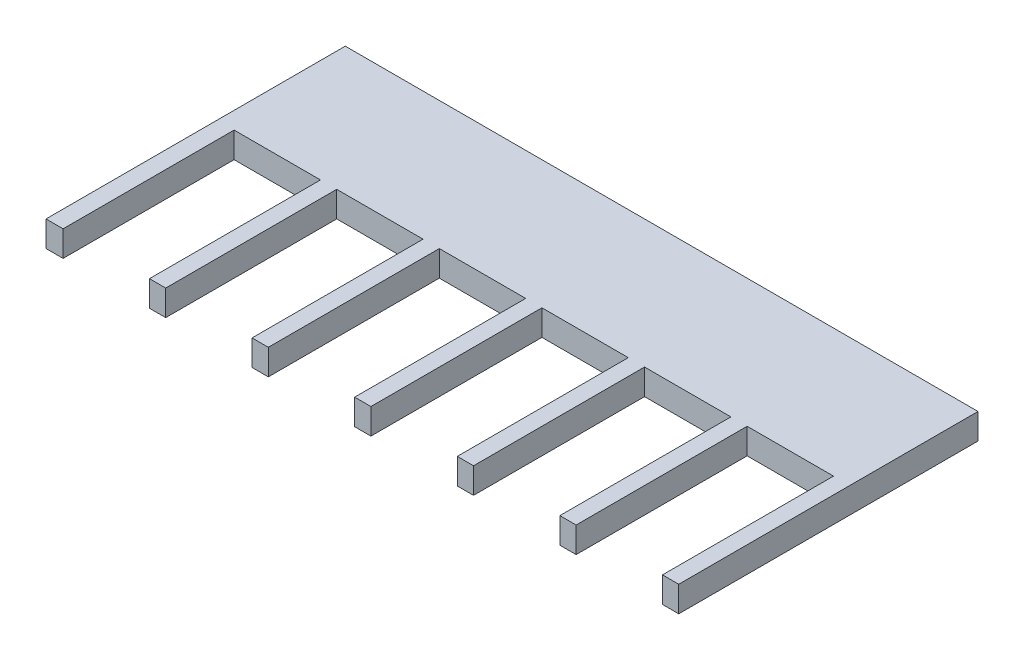
ISO-10303-21;
HEADER;
FILE_DESCRIPTION(('STEP AP214'),'2;1');
FILE_NAME('part.step','',(''),(''),'','','');
FILE_SCHEMA(('AUTOMOTIVE_DESIGN { 1 0 10303 214 1 1 1 1 }'));
ENDSEC;
DATA;
#1=APPLICATION_CONTEXT('core data for automotive mechanical design processes');
#2=APPLICATION_PROTOCOL_DEFINITION('international standard','automotive_design',2000,#1);
#3=PRODUCT_CONTEXT('',#1,'mechanical');
#4=PRODUCT('Part','Part','',(#3));
#5=PRODUCT_RELATED_PRODUCT_CATEGORY('part','',(#4));
#6=PRODUCT_DEFINITION_FORMATION('','',#4);
#7=PRODUCT_DEFINITION_CONTEXT('part definition',#1,'design');
#8=PRODUCT_DEFINITION('design','',#6,#7);
#9=PRODUCT_DEFINITION_SHAPE('','',#8);
#10=(LENGTH_UNIT() NAMED_UNIT(*) SI_UNIT(.MILLI.,.METRE.));
#11=(NAMED_UNIT(*) PLANE_ANGLE_UNIT() SI_UNIT($,.RADIAN.));
#12=(NAMED_UNIT(*) SI_UNIT($,.STERADIAN.) SOLID_ANGLE_UNIT());
#13=UNCERTAINTY_MEASURE_WITH_UNIT(LENGTH_MEASURE(1.E-05),#10,'distance_accuracy_value','');
#14=(GEOMETRIC_REPRESENTATION_CONTEXT(3) GLOBAL_UNCERTAINTY_ASSIGNED_CONTEXT((#13)) GLOBAL_UNIT_ASSIGNED_CONTEXT((#10,
#11,#12)) REPRESENTATION_CONTEXT('',''));
#15=CARTESIAN_POINT('',(0.,0.,0.));
#16=DIRECTION('',(0.,0.,1.));
#17=DIRECTION('',(1.,0.,0.));
#18=AXIS2_PLACEMENT_3D('',#15,#16,#17);
#19=CARTESIAN_POINT('',(0.,3.,0.));
#20=DIRECTION('',(0.,0.,1.));
#21=DIRECTION('',(1.,0.,0.));
#22=AXIS2_PLACEMENT_3D('',#19,#20,#21);
#23=PLANE('',#22);
#24=DIRECTION('',(-1.,0.,0.));
#25=VECTOR('',#24,1.);
#26=CARTESIAN_POINT('',(0.,0.,0.));
#27=LINE('',#26,#25);
#28=CARTESIAN_POINT('',(73.9999999999999,0.,0.));
#29=VERTEX_POINT('',#28);
#30=CARTESIAN_POINT('',(0.,0.,0.));
#31=VERTEX_POINT('',#30);
#32=EDGE_CURVE('E249',#29,#31,#27,.T.);
#33=ORIENTED_EDGE('',*,*,#32,.T.);
#34=DIRECTION('',(0.,-1.,0.));
#35=VECTOR('',#34,1.);
#36=CARTESIAN_POINT('',(0.,3.,0.));
#37=LINE('',#36,#35);
#38=CARTESIAN_POINT('',(0.,3.,0.));
#39=VERTEX_POINT('',#38);
#40=EDGE_CURVE('E11',#39,#31,#37,.T.);
#41=ORIENTED_EDGE('',*,*,#40,.F.);
#42=DIRECTION('',(-1.,0.,0.));
#43=VECTOR('',#42,1.);
#44=CARTESIAN_POINT('',(0.,3.,0.));
#45=LINE('',#44,#43);
#46=CARTESIAN_POINT('',(73.9999999999999,3.,0.));
#47=VERTEX_POINT('',#46);
#48=EDGE_CURVE('E309',#47,#39,#45,.T.);
#49=ORIENTED_EDGE('',*,*,#48,.F.);
#50=DIRECTION('',(0.,-1.,0.));
#51=VECTOR('',#50,1.);
#52=CARTESIAN_POINT('',(73.9999999999999,3.,0.));
#53=LINE('',#52,#51);
#54=EDGE_CURVE('E245',#47,#29,#53,.T.);
#55=ORIENTED_EDGE('',*,*,#54,.T.);
#56=EDGE_LOOP('',(#33,#41,#49,#55));
#57=FACE_BOUND('',#56,.T.);
#58=ADVANCED_FACE('F33',(#57),#23,.F.);
#59=CARTESIAN_POINT('',(0.,3.,35.));
#60=DIRECTION('',(1.,0.,0.));
#61=DIRECTION('',(0.,0.,-1.));
#62=AXIS2_PLACEMENT_3D('',#59,#60,#61);
#63=PLANE('',#62);
#64=DIRECTION('',(0.,0.,1.));
#65=VECTOR('',#64,1.);
#66=CARTESIAN_POINT('',(0.,0.,35.));
#67=LINE('',#66,#65);
#68=CARTESIAN_POINT('',(0.,0.,35.));
#69=VERTEX_POINT('',#68);
#70=EDGE_CURVE('E252',#31,#69,#67,.T.);
#71=ORIENTED_EDGE('',*,*,#70,.T.);
#72=DIRECTION('',(0.,-1.,0.));
#73=VECTOR('',#72,1.);
#74=CARTESIAN_POINT('',(0.,3.,35.));
#75=LINE('',#74,#73);
#76=CARTESIAN_POINT('',(0.,3.,35.));
#77=VERTEX_POINT('',#76);
#78=EDGE_CURVE('E41',#77,#69,#75,.T.);
#79=ORIENTED_EDGE('',*,*,#78,.F.);
#80=DIRECTION('',(0.,0.,1.));
#81=VECTOR('',#80,1.);
#82=CARTESIAN_POINT('',(0.,3.,35.));
#83=LINE('',#82,#81);
#84=EDGE_CURVE('E152',#39,#77,#83,.T.);
#85=ORIENTED_EDGE('',*,*,#84,.F.);
#86=ORIENTED_EDGE('',*,*,#40,.T.);
#87=EDGE_LOOP('',(#71,#79,#85,#86));
#88=FACE_BOUND('',#87,.T.);
#89=ADVANCED_FACE('F465',(#88),#63,.F.);
#90=CARTESIAN_POINT('',(0.,3.,35.));
#91=DIRECTION('',(0.,0.,-1.));
#92=DIRECTION('',(-1.,0.,0.));
#93=AXIS2_PLACEMENT_3D('',#90,#91,#92);
#94=PLANE('',#93);
#95=DIRECTION('',(1.,0.,0.));
#96=VECTOR('',#95,1.);
#97=CARTESIAN_POINT('',(0.,0.,35.));
#98=LINE('',#97,#96);
#99=CARTESIAN_POINT('',(2.00000000000001,0.,35.));
#100=VERTEX_POINT('',#99);
#101=EDGE_CURVE('E254',#69,#100,#98,.T.);
#102=ORIENTED_EDGE('',*,*,#101,.T.);
#103=DIRECTION('',(0.,-1.,0.));
#104=VECTOR('',#103,1.);
#105=CARTESIAN_POINT('',(2.00000000000001,3.,35.));
#106=LINE('',#105,#104);
#107=CARTESIAN_POINT('',(2.00000000000001,3.,35.));
#108=VERTEX_POINT('',#107);
#109=EDGE_CURVE('E376',#108,#100,#106,.T.);
#110=ORIENTED_EDGE('',*,*,#109,.F.);
#111=DIRECTION('',(1.,0.,0.));
#112=VECTOR('',#111,1.);
#113=CARTESIAN_POINT('',(0.,3.,35.));
#114=LINE('',#113,#112);
#115=EDGE_CURVE('E384',#77,#108,#114,.T.);
#116=ORIENTED_EDGE('',*,*,#115,.F.);
#117=ORIENTED_EDGE('',*,*,#78,.T.);
#118=EDGE_LOOP('',(#102,#110,#116,#117));
#119=FACE_BOUND('',#118,.T.);
#120=ADVANCED_FACE('F382',(#119),#94,.F.);
#121=CARTESIAN_POINT('',(2.00000000000001,3.,35.));
#122=DIRECTION('',(-1.,0.,0.));
#123=DIRECTION('',(0.,0.,1.));
#124=AXIS2_PLACEMENT_3D('',#121,#122,#123);
#125=PLANE('',#124);
#126=DIRECTION('',(0.,0.,-1.));
#127=VECTOR('',#126,1.);
#128=CARTESIAN_POINT('',(2.00000000000001,0.,35.));
#129=LINE('',#128,#127);
#130=CARTESIAN_POINT('',(2.,0.,15.));
#131=VERTEX_POINT('',#130);
#132=EDGE_CURVE('E256',#100,#131,#129,.T.);
#133=ORIENTED_EDGE('',*,*,#132,.T.);
#134=DIRECTION('',(0.,-1.,0.));
#135=VECTOR('',#134,1.);
#136=CARTESIAN_POINT('',(2.,3.,15.));
#137=LINE('',#136,#135);
#138=CARTESIAN_POINT('',(2.,3.,15.));
#139=VERTEX_POINT('',#138);
#140=EDGE_CURVE('E373',#139,#131,#137,.T.);
#141=ORIENTED_EDGE('',*,*,#140,.F.);
#142=DIRECTION('',(0.,0.,-1.));
#143=VECTOR('',#142,1.);
#144=CARTESIAN_POINT('',(2.00000000000001,3.,35.));
#145=LINE('',#144,#143);
#146=EDGE_CURVE('E401',#108,#139,#145,.T.);
#147=ORIENTED_EDGE('',*,*,#146,.F.);
#148=ORIENTED_EDGE('',*,*,#109,.T.);
#149=EDGE_LOOP('',(#133,#141,#147,#148));
#150=FACE_BOUND('',#149,.T.);
#151=ADVANCED_FACE('F392',(#150),#125,.F.);
#152=CARTESIAN_POINT('',(12.1,3.,15.));
#153=DIRECTION('',(0.,0.,-1.));
#154=DIRECTION('',(-1.,0.,0.));
#155=AXIS2_PLACEMENT_3D('',#152,#153,#154);
#156=PLANE('',#155);
#157=DIRECTION('',(1.,0.,0.));
#158=VECTOR('',#157,1.);
#159=CARTESIAN_POINT('',(12.1,0.,15.));
#160=LINE('',#159,#158);
#161=CARTESIAN_POINT('',(12.1,0.,15.));
#162=VERTEX_POINT('',#161);
#163=EDGE_CURVE('E259',#131,#162,#160,.T.);
#164=ORIENTED_EDGE('',*,*,#163,.T.);
#165=DIRECTION('',(0.,-1.,0.));
#166=VECTOR('',#165,1.);
#167=CARTESIAN_POINT('',(12.1,3.,15.));
#168=LINE('',#167,#166);
#169=CARTESIAN_POINT('',(12.1,3.,15.));
#170=VERTEX_POINT('',#169);
#171=EDGE_CURVE('E370',#170,#162,#168,.T.);
#172=ORIENTED_EDGE('',*,*,#171,.F.);
#173=DIRECTION('',(1.,0.,0.));
#174=VECTOR('',#173,1.);
#175=CARTESIAN_POINT('',(2.,3.,15.));
#176=LINE('',#175,#174);
#177=EDGE_CURVE('E398',#139,#170,#176,.T.);
#178=ORIENTED_EDGE('',*,*,#177,.F.);
#179=ORIENTED_EDGE('',*,*,#140,.T.);
#180=EDGE_LOOP('',(#164,#172,#178,#179));
#181=FACE_BOUND('',#180,.T.);
#182=ADVANCED_FACE('F396',(#181),#156,.F.);
#183=CARTESIAN_POINT('',(12.1,3.,15.));
#184=DIRECTION('',(1.,0.,0.));
#185=DIRECTION('',(0.,0.,-1.));
#186=AXIS2_PLACEMENT_3D('',#183,#184,#185);
#187=PLANE('',#186);
#188=DIRECTION('',(0.,0.,1.));
#189=VECTOR('',#188,1.);
#190=CARTESIAN_POINT('',(12.1,0.,15.));
#191=LINE('',#190,#189);
#192=CARTESIAN_POINT('',(12.1,0.,35.));
#193=VERTEX_POINT('',#192);
#194=EDGE_CURVE('E261',#162,#193,#191,.T.);
#195=ORIENTED_EDGE('',*,*,#194,.T.);
#196=DIRECTION('',(0.,-1.,0.));
#197=VECTOR('',#196,1.);
#198=CARTESIAN_POINT('',(12.1,3.,35.));
#199=LINE('',#198,#197);
#200=CARTESIAN_POINT('',(12.1,3.,35.));
#201=VERTEX_POINT('',#200);
#202=EDGE_CURVE('E367',#201,#193,#199,.T.);
#203=ORIENTED_EDGE('',*,*,#202,.F.);
#204=DIRECTION('',(0.,0.,1.));
#205=VECTOR('',#204,1.);
#206=CARTESIAN_POINT('',(12.1,3.,15.));
#207=LINE('',#206,#205);
#208=EDGE_CURVE('E400',#170,#201,#207,.T.);
#209=ORIENTED_EDGE('',*,*,#208,.F.);
#210=ORIENTED_EDGE('',*,*,#171,.T.);
#211=EDGE_LOOP('',(#195,#203,#209,#210));
#212=FACE_BOUND('',#211,.T.);
#213=ADVANCED_FACE('F478',(#212),#187,.F.);
#214=CARTESIAN_POINT('',(12.1,3.,35.));
#215=DIRECTION('',(0.,0.,-1.));
#216=DIRECTION('',(-1.,0.,0.));
#217=AXIS2_PLACEMENT_3D('',#214,#215,#216);
#218=PLANE('',#217);
#219=DIRECTION('',(1.,0.,0.));
#220=VECTOR('',#219,1.);
#221=CARTESIAN_POINT('',(12.1,0.,35.));
#222=LINE('',#221,#220);
#223=CARTESIAN_POINT('',(14.,0.,35.));
#224=VERTEX_POINT('',#223);
#225=EDGE_CURVE('E263',#193,#224,#222,.T.);
#226=ORIENTED_EDGE('',*,*,#225,.T.);
#227=DIRECTION('',(0.,-1.,0.));
#228=VECTOR('',#227,1.);
#229=CARTESIAN_POINT('',(14.,3.,35.));
#230=LINE('',#229,#228);
#231=CARTESIAN_POINT('',(14.,3.,35.));
#232=VERTEX_POINT('',#231);
#233=EDGE_CURVE('E364',#232,#224,#230,.T.);
#234=ORIENTED_EDGE('',*,*,#233,.F.);
#235=DIRECTION('',(1.,0.,0.));
#236=VECTOR('',#235,1.);
#237=CARTESIAN_POINT('',(12.1,3.,35.));
#238=LINE('',#237,#236);
#239=EDGE_CURVE('E403',#201,#232,#238,.T.);
#240=ORIENTED_EDGE('',*,*,#239,.F.);
#241=ORIENTED_EDGE('',*,*,#202,.T.);
#242=EDGE_LOOP('',(#226,#234,#240,#241));
#243=FACE_BOUND('',#242,.T.);
#244=ADVANCED_FACE('F481',(#243),#218,.F.);
#245=CARTESIAN_POINT('',(14.,3.,35.));
#246=DIRECTION('',(-1.,0.,0.));
#247=DIRECTION('',(0.,0.,1.));
#248=AXIS2_PLACEMENT_3D('',#245,#246,#247);
#249=PLANE('',#248);
#250=DIRECTION('',(0.,0.,-1.));
#251=VECTOR('',#250,1.);
#252=CARTESIAN_POINT('',(14.,0.,35.));
#253=LINE('',#252,#251);
#254=CARTESIAN_POINT('',(14.,0.,15.));
#255=VERTEX_POINT('',#254);
#256=EDGE_CURVE('E265',#224,#255,#253,.T.);
#257=ORIENTED_EDGE('',*,*,#256,.T.);
#258=DIRECTION('',(0.,-1.,0.));
#259=VECTOR('',#258,1.);
#260=CARTESIAN_POINT('',(14.,3.,15.));
#261=LINE('',#260,#259);
#262=CARTESIAN_POINT('',(14.,3.,15.));
#263=VERTEX_POINT('',#262);
#264=EDGE_CURVE('E361',#263,#255,#261,.T.);
#265=ORIENTED_EDGE('',*,*,#264,.F.);
#266=DIRECTION('',(0.,0.,-1.));
#267=VECTOR('',#266,1.);
#268=CARTESIAN_POINT('',(14.,3.,35.));
#269=LINE('',#268,#267);
#270=EDGE_CURVE('E409',#232,#263,#269,.T.);
#271=ORIENTED_EDGE('',*,*,#270,.F.);
#272=ORIENTED_EDGE('',*,*,#233,.T.);
#273=EDGE_LOOP('',(#257,#265,#271,#272));
#274=FACE_BOUND('',#273,.T.);
#275=ADVANCED_FACE('F485',(#274),#249,.F.);
#276=CARTESIAN_POINT('',(24.1,3.,15.));
#277=DIRECTION('',(0.,0.,-1.));
#278=DIRECTION('',(-1.,0.,0.));
#279=AXIS2_PLACEMENT_3D('',#276,#277,#278);
#280=PLANE('',#279);
#281=DIRECTION('',(1.,0.,0.));
#282=VECTOR('',#281,1.);
#283=CARTESIAN_POINT('',(24.1,0.,15.));
#284=LINE('',#283,#282);
#285=CARTESIAN_POINT('',(24.1,0.,15.));
#286=VERTEX_POINT('',#285);
#287=EDGE_CURVE('E268',#255,#286,#284,.T.);
#288=ORIENTED_EDGE('',*,*,#287,.T.);
#289=DIRECTION('',(0.,-1.,0.));
#290=VECTOR('',#289,1.);
#291=CARTESIAN_POINT('',(24.1,3.,15.));
#292=LINE('',#291,#290);
#293=CARTESIAN_POINT('',(24.1,3.,15.));
#294=VERTEX_POINT('',#293);
#295=EDGE_CURVE('E358',#294,#286,#292,.T.);
#296=ORIENTED_EDGE('',*,*,#295,.F.);
#297=DIRECTION('',(1.,0.,0.));
#298=VECTOR('',#297,1.);
#299=CARTESIAN_POINT('',(14.,3.,15.));
#300=LINE('',#299,#298);
#301=EDGE_CURVE('E411',#263,#294,#300,.T.);
#302=ORIENTED_EDGE('',*,*,#301,.F.);
#303=ORIENTED_EDGE('',*,*,#264,.T.);
#304=EDGE_LOOP('',(#288,#296,#302,#303));
#305=FACE_BOUND('',#304,.T.);
#306=ADVANCED_FACE('F489',(#305),#280,.F.);
#307=CARTESIAN_POINT('',(24.1,3.,15.));
#308=DIRECTION('',(1.,0.,0.));
#309=DIRECTION('',(0.,0.,-1.));
#310=AXIS2_PLACEMENT_3D('',#307,#308,#309);
#311=PLANE('',#310);
#312=DIRECTION('',(0.,0.,1.));
#313=VECTOR('',#312,1.);
#314=CARTESIAN_POINT('',(24.1,0.,15.));
#315=LINE('',#314,#313);
#316=CARTESIAN_POINT('',(24.1,0.,35.));
#317=VERTEX_POINT('',#316);
#318=EDGE_CURVE('E270',#286,#317,#315,.T.);
#319=ORIENTED_EDGE('',*,*,#318,.T.);
#320=DIRECTION('',(0.,-1.,0.));
#321=VECTOR('',#320,1.);
#322=CARTESIAN_POINT('',(24.1,3.,35.));
#323=LINE('',#322,#321);
#324=CARTESIAN_POINT('',(24.1,3.,35.));
#325=VERTEX_POINT('',#324);
#326=EDGE_CURVE('E355',#325,#317,#323,.T.);
#327=ORIENTED_EDGE('',*,*,#326,.F.);
#328=DIRECTION('',(0.,0.,1.));
#329=VECTOR('',#328,1.);
#330=CARTESIAN_POINT('',(24.1,3.,15.));
#331=LINE('',#330,#329);
#332=EDGE_CURVE('E413',#294,#325,#331,.T.);
#333=ORIENTED_EDGE('',*,*,#332,.F.);
#334=ORIENTED_EDGE('',*,*,#295,.T.);
#335=EDGE_LOOP('',(#319,#327,#333,#334));
#336=FACE_BOUND('',#335,.T.);
#337=ADVANCED_FACE('F493',(#336),#311,.F.);
#338=CARTESIAN_POINT('',(24.1,3.,35.));
#339=DIRECTION('',(0.,0.,-1.));
#340=DIRECTION('',(-1.,0.,0.));
#341=AXIS2_PLACEMENT_3D('',#338,#339,#340);
#342=PLANE('',#341);
#343=DIRECTION('',(1.,0.,0.));
#344=VECTOR('',#343,1.);
#345=CARTESIAN_POINT('',(24.1,0.,35.));
#346=LINE('',#345,#344);
#347=CARTESIAN_POINT('',(26.,0.,35.));
#348=VERTEX_POINT('',#347);
#349=EDGE_CURVE('E272',#317,#348,#346,.T.);
#350=ORIENTED_EDGE('',*,*,#349,.T.);
#351=DIRECTION('',(0.,-1.,0.));
#352=VECTOR('',#351,1.);
#353=CARTESIAN_POINT('',(26.,3.,35.));
#354=LINE('',#353,#352);
#355=CARTESIAN_POINT('',(26.,3.,35.));
#356=VERTEX_POINT('',#355);
#357=EDGE_CURVE('E352',#356,#348,#354,.T.);
#358=ORIENTED_EDGE('',*,*,#357,.F.);
#359=DIRECTION('',(1.,0.,0.));
#360=VECTOR('',#359,1.);
#361=CARTESIAN_POINT('',(24.1,3.,35.));
#362=LINE('',#361,#360);
#363=EDGE_CURVE('E415',#325,#356,#362,.T.);
#364=ORIENTED_EDGE('',*,*,#363,.F.);
#365=ORIENTED_EDGE('',*,*,#326,.T.);
#366=EDGE_LOOP('',(#350,#358,#364,#365));
#367=FACE_BOUND('',#366,.T.);
#368=ADVANCED_FACE('F497',(#367),#342,.F.);
#369=CARTESIAN_POINT('',(26.,3.,35.));
#370=DIRECTION('',(-1.,0.,0.));
#371=DIRECTION('',(0.,0.,1.));
#372=AXIS2_PLACEMENT_3D('',#369,#370,#371);
#373=PLANE('',#372);
#374=DIRECTION('',(0.,0.,-1.));
#375=VECTOR('',#374,1.);
#376=CARTESIAN_POINT('',(26.,0.,35.));
#377=LINE('',#376,#375);
#378=CARTESIAN_POINT('',(26.,0.,15.));
#379=VERTEX_POINT('',#378);
#380=EDGE_CURVE('E274',#348,#379,#377,.T.);
#381=ORIENTED_EDGE('',*,*,#380,.T.);
#382=DIRECTION('',(0.,-1.,0.));
#383=VECTOR('',#382,1.);
#384=CARTESIAN_POINT('',(26.,3.,15.));
#385=LINE('',#384,#383);
#386=CARTESIAN_POINT('',(26.,3.,15.));
#387=VERTEX_POINT('',#386);
#388=EDGE_CURVE('E349',#387,#379,#385,.T.);
#389=ORIENTED_EDGE('',*,*,#388,.F.);
#390=DIRECTION('',(0.,0.,-1.));
#391=VECTOR('',#390,1.);
#392=CARTESIAN_POINT('',(26.,3.,35.));
#393=LINE('',#392,#391);
#394=EDGE_CURVE('E417',#356,#387,#393,.T.);
#395=ORIENTED_EDGE('',*,*,#394,.F.);
#396=ORIENTED_EDGE('',*,*,#357,.T.);
#397=EDGE_LOOP('',(#381,#389,#395,#396));
#398=FACE_BOUND('',#397,.T.);
#399=ADVANCED_FACE('F501',(#398),#373,.F.);
#400=CARTESIAN_POINT('',(36.1,3.,15.));
#401=DIRECTION('',(0.,0.,-1.));
#402=DIRECTION('',(-1.,0.,0.));
#403=AXIS2_PLACEMENT_3D('',#400,#401,#402);
#404=PLANE('',#403);
#405=DIRECTION('',(1.,0.,0.));
#406=VECTOR('',#405,1.);
#407=CARTESIAN_POINT('',(36.1,0.,15.));
#408=LINE('',#407,#406);
#409=CARTESIAN_POINT('',(36.1,0.,15.));
#410=VERTEX_POINT('',#409);
#411=EDGE_CURVE('E277',#379,#410,#408,.T.);
#412=ORIENTED_EDGE('',*,*,#411,.T.);
#413=DIRECTION('',(0.,-1.,0.));
#414=VECTOR('',#413,1.);
#415=CARTESIAN_POINT('',(36.1,3.,15.));
#416=LINE('',#415,#414);
#417=CARTESIAN_POINT('',(36.1,3.,15.));
#418=VERTEX_POINT('',#417);
#419=EDGE_CURVE('E346',#418,#410,#416,.T.);
#420=ORIENTED_EDGE('',*,*,#419,.F.);
#421=DIRECTION('',(1.,0.,0.));
#422=VECTOR('',#421,1.);
#423=CARTESIAN_POINT('',(26.,3.,15.));
#424=LINE('',#423,#422);
#425=EDGE_CURVE('E419',#387,#418,#424,.T.);
#426=ORIENTED_EDGE('',*,*,#425,.F.);
#427=ORIENTED_EDGE('',*,*,#388,.T.);
#428=EDGE_LOOP('',(#412,#420,#426,#427));
#429=FACE_BOUND('',#428,.T.);
#430=ADVANCED_FACE('F505',(#429),#404,.F.);
#431=CARTESIAN_POINT('',(36.1,3.,15.));
#432=DIRECTION('',(1.,0.,0.));
#433=DIRECTION('',(0.,0.,-1.));
#434=AXIS2_PLACEMENT_3D('',#431,#432,#433);
#435=PLANE('',#434);
#436=DIRECTION('',(0.,0.,1.));
#437=VECTOR('',#436,1.);
#438=CARTESIAN_POINT('',(36.1,0.,15.));
#439=LINE('',#438,#437);
#440=CARTESIAN_POINT('',(36.1,0.,35.));
#441=VERTEX_POINT('',#440);
#442=EDGE_CURVE('E279',#410,#441,#439,.T.);
#443=ORIENTED_EDGE('',*,*,#442,.T.);
#444=DIRECTION('',(0.,-1.,0.));
#445=VECTOR('',#444,1.);
#446=CARTESIAN_POINT('',(36.1,3.,35.));
#447=LINE('',#446,#445);
#448=CARTESIAN_POINT('',(36.1,3.,35.));
#449=VERTEX_POINT('',#448);
#450=EDGE_CURVE('E343',#449,#441,#447,.T.);
#451=ORIENTED_EDGE('',*,*,#450,.F.);
#452=DIRECTION('',(0.,0.,1.));
#453=VECTOR('',#452,1.);
#454=CARTESIAN_POINT('',(36.1,3.,15.));
#455=LINE('',#454,#453);
#456=EDGE_CURVE('E421',#418,#449,#455,.T.);
#457=ORIENTED_EDGE('',*,*,#456,.F.);
#458=ORIENTED_EDGE('',*,*,#419,.T.);
#459=EDGE_LOOP('',(#443,#451,#457,#458));
#460=FACE_BOUND('',#459,.T.);
#461=ADVANCED_FACE('F509',(#460),#435,.F.);
#462=CARTESIAN_POINT('',(36.1,3.,35.));
#463=DIRECTION('',(0.,0.,-1.));
#464=DIRECTION('',(-1.,0.,0.));
#465=AXIS2_PLACEMENT_3D('',#462,#463,#464);
#466=PLANE('',#465);
#467=DIRECTION('',(1.,0.,0.));
#468=VECTOR('',#467,1.);
#469=CARTESIAN_POINT('',(36.1,0.,35.));
#470=LINE('',#469,#468);
#471=CARTESIAN_POINT('',(38.,0.,35.));
#472=VERTEX_POINT('',#471);
#473=EDGE_CURVE('E281',#441,#472,#470,.T.);
#474=ORIENTED_EDGE('',*,*,#473,.T.);
#475=DIRECTION('',(0.,-1.,0.));
#476=VECTOR('',#475,1.);
#477=CARTESIAN_POINT('',(38.,3.,35.));
#478=LINE('',#477,#476);
#479=CARTESIAN_POINT('',(38.,3.,35.));
#480=VERTEX_POINT('',#479);
#481=EDGE_CURVE('E340',#480,#472,#478,.T.);
#482=ORIENTED_EDGE('',*,*,#481,.F.);
#483=DIRECTION('',(1.,0.,0.));
#484=VECTOR('',#483,1.);
#485=CARTESIAN_POINT('',(36.1,3.,35.));
#486=LINE('',#485,#484);
#487=EDGE_CURVE('E423',#449,#480,#486,.T.);
#488=ORIENTED_EDGE('',*,*,#487,.F.);
#489=ORIENTED_EDGE('',*,*,#450,.T.);
#490=EDGE_LOOP('',(#474,#482,#488,#489));
#491=FACE_BOUND('',#490,.T.);
#492=ADVANCED_FACE('F513',(#491),#466,.F.);
#493=CARTESIAN_POINT('',(38.,3.,35.));
#494=DIRECTION('',(-1.,0.,0.));
#495=DIRECTION('',(0.,0.,1.));
#496=AXIS2_PLACEMENT_3D('',#493,#494,#495);
#497=PLANE('',#496);
#498=DIRECTION('',(0.,0.,-1.));
#499=VECTOR('',#498,1.);
#500=CARTESIAN_POINT('',(38.,0.,35.));
#501=LINE('',#500,#499);
#502=CARTESIAN_POINT('',(38.,0.,15.));
#503=VERTEX_POINT('',#502);
#504=EDGE_CURVE('E283',#472,#503,#501,.T.);
#505=ORIENTED_EDGE('',*,*,#504,.T.);
#506=DIRECTION('',(0.,-1.,0.));
#507=VECTOR('',#506,1.);
#508=CARTESIAN_POINT('',(38.,3.,15.));
#509=LINE('',#508,#507);
#510=CARTESIAN_POINT('',(38.,3.,15.));
#511=VERTEX_POINT('',#510);
#512=EDGE_CURVE('E337',#511,#503,#509,.T.);
#513=ORIENTED_EDGE('',*,*,#512,.F.);
#514=DIRECTION('',(0.,0.,-1.));
#515=VECTOR('',#514,1.);
#516=CARTESIAN_POINT('',(38.,3.,35.));
#517=LINE('',#516,#515);
#518=EDGE_CURVE('E425',#480,#511,#517,.T.);
#519=ORIENTED_EDGE('',*,*,#518,.F.);
#520=ORIENTED_EDGE('',*,*,#481,.T.);
#521=EDGE_LOOP('',(#505,#513,#519,#520));
#522=FACE_BOUND('',#521,.T.);
#523=ADVANCED_FACE('F517',(#522),#497,.F.);
#524=CARTESIAN_POINT('',(48.1,3.,15.));
#525=DIRECTION('',(0.,0.,-1.));
#526=DIRECTION('',(-1.,0.,0.));
#527=AXIS2_PLACEMENT_3D('',#524,#525,#526);
#528=PLANE('',#527);
#529=DIRECTION('',(1.,0.,0.));
#530=VECTOR('',#529,1.);
#531=CARTESIAN_POINT('',(48.1,0.,15.));
#532=LINE('',#531,#530);
#533=CARTESIAN_POINT('',(48.1,0.,15.));
#534=VERTEX_POINT('',#533);
#535=EDGE_CURVE('E286',#503,#534,#532,.T.);
#536=ORIENTED_EDGE('',*,*,#535,.T.);
#537=DIRECTION('',(0.,-1.,0.));
#538=VECTOR('',#537,1.);
#539=CARTESIAN_POINT('',(48.1,3.,15.));
#540=LINE('',#539,#538);
#541=CARTESIAN_POINT('',(48.1,3.,15.));
#542=VERTEX_POINT('',#541);
#543=EDGE_CURVE('E334',#542,#534,#540,.T.);
#544=ORIENTED_EDGE('',*,*,#543,.F.);
#545=DIRECTION('',(1.,0.,0.));
#546=VECTOR('',#545,1.);
#547=CARTESIAN_POINT('',(38.,3.,15.));
#548=LINE('',#547,#546);
#549=EDGE_CURVE('E427',#511,#542,#548,.T.);
#550=ORIENTED_EDGE('',*,*,#549,.F.);
#551=ORIENTED_EDGE('',*,*,#512,.T.);
#552=EDGE_LOOP('',(#536,#544,#550,#551));
#553=FACE_BOUND('',#552,.T.);
#554=ADVANCED_FACE('F521',(#553),#528,.F.);
#555=CARTESIAN_POINT('',(48.1,3.,15.));
#556=DIRECTION('',(1.,0.,0.));
#557=DIRECTION('',(0.,0.,-1.));
#558=AXIS2_PLACEMENT_3D('',#555,#556,#557);
#559=PLANE('',#558);
#560=DIRECTION('',(0.,0.,1.));
#561=VECTOR('',#560,1.);
#562=CARTESIAN_POINT('',(48.1,0.,15.));
#563=LINE('',#562,#561);
#564=CARTESIAN_POINT('',(48.1,0.,35.));
#565=VERTEX_POINT('',#564);
#566=EDGE_CURVE('E288',#534,#565,#563,.T.);
#567=ORIENTED_EDGE('',*,*,#566,.T.);
#568=DIRECTION('',(0.,-1.,0.));
#569=VECTOR('',#568,1.);
#570=CARTESIAN_POINT('',(48.1,3.,35.));
#571=LINE('',#570,#569);
#572=CARTESIAN_POINT('',(48.1,3.,35.));
#573=VERTEX_POINT('',#572);
#574=EDGE_CURVE('E331',#573,#565,#571,.T.);
#575=ORIENTED_EDGE('',*,*,#574,.F.);
#576=DIRECTION('',(0.,0.,1.));
#577=VECTOR('',#576,1.);
#578=CARTESIAN_POINT('',(48.1,3.,15.));
#579=LINE('',#578,#577);
#580=EDGE_CURVE('E429',#542,#573,#579,.T.);
#581=ORIENTED_EDGE('',*,*,#580,.F.);
#582=ORIENTED_EDGE('',*,*,#543,.T.);
#583=EDGE_LOOP('',(#567,#575,#581,#582));
#584=FACE_BOUND('',#583,.T.);
#585=ADVANCED_FACE('F525',(#584),#559,.F.);
#586=CARTESIAN_POINT('',(48.1,3.,35.));
#587=DIRECTION('',(0.,0.,-1.));
#588=DIRECTION('',(-1.,0.,0.));
#589=AXIS2_PLACEMENT_3D('',#586,#587,#588);
#590=PLANE('',#589);
#591=DIRECTION('',(1.,0.,0.));
#592=VECTOR('',#591,1.);
#593=CARTESIAN_POINT('',(48.1,0.,35.));
#594=LINE('',#593,#592);
#595=CARTESIAN_POINT('',(50.,0.,35.));
#596=VERTEX_POINT('',#595);
#597=EDGE_CURVE('E290',#565,#596,#594,.T.);
#598=ORIENTED_EDGE('',*,*,#597,.T.);
#599=DIRECTION('',(0.,-1.,0.));
#600=VECTOR('',#599,1.);
#601=CARTESIAN_POINT('',(50.,3.,35.));
#602=LINE('',#601,#600);
#603=CARTESIAN_POINT('',(50.,3.,35.));
#604=VERTEX_POINT('',#603);
#605=EDGE_CURVE('E328',#604,#596,#602,.T.);
#606=ORIENTED_EDGE('',*,*,#605,.F.);
#607=DIRECTION('',(1.,0.,0.));
#608=VECTOR('',#607,1.);
#609=CARTESIAN_POINT('',(48.1,3.,35.));
#610=LINE('',#609,#608);
#611=EDGE_CURVE('E431',#573,#604,#610,.T.);
#612=ORIENTED_EDGE('',*,*,#611,.F.);
#613=ORIENTED_EDGE('',*,*,#574,.T.);
#614=EDGE_LOOP('',(#598,#606,#612,#613));
#615=FACE_BOUND('',#614,.T.);
#616=ADVANCED_FACE('F529',(#615),#590,.F.);
#617=CARTESIAN_POINT('',(50.,3.,35.));
#618=DIRECTION('',(-1.,0.,0.));
#619=DIRECTION('',(0.,0.,1.));
#620=AXIS2_PLACEMENT_3D('',#617,#618,#619);
#621=PLANE('',#620);
#622=DIRECTION('',(0.,0.,-1.));
#623=VECTOR('',#622,1.);
#624=CARTESIAN_POINT('',(50.,0.,35.));
#625=LINE('',#624,#623);
#626=CARTESIAN_POINT('',(50.,0.,15.));
#627=VERTEX_POINT('',#626);
#628=EDGE_CURVE('E292',#596,#627,#625,.T.);
#629=ORIENTED_EDGE('',*,*,#628,.T.);
#630=DIRECTION('',(0.,-1.,0.));
#631=VECTOR('',#630,1.);
#632=CARTESIAN_POINT('',(50.,3.,15.));
#633=LINE('',#632,#631);
#634=CARTESIAN_POINT('',(50.,3.,15.));
#635=VERTEX_POINT('',#634);
#636=EDGE_CURVE('E325',#635,#627,#633,.T.);
#637=ORIENTED_EDGE('',*,*,#636,.F.);
#638=DIRECTION('',(0.,0.,-1.));
#639=VECTOR('',#638,1.);
#640=CARTESIAN_POINT('',(50.,3.,35.));
#641=LINE('',#640,#639);
#642=EDGE_CURVE('E433',#604,#635,#641,.T.);
#643=ORIENTED_EDGE('',*,*,#642,.F.);
#644=ORIENTED_EDGE('',*,*,#605,.T.);
#645=EDGE_LOOP('',(#629,#637,#643,#644));
#646=FACE_BOUND('',#645,.T.);
#647=ADVANCED_FACE('F533',(#646),#621,.F.);
#648=CARTESIAN_POINT('',(60.1,3.,15.));
#649=DIRECTION('',(0.,0.,-1.));
#650=DIRECTION('',(-1.,0.,0.));
#651=AXIS2_PLACEMENT_3D('',#648,#649,#650);
#652=PLANE('',#651);
#653=DIRECTION('',(1.,0.,0.));
#654=VECTOR('',#653,1.);
#655=CARTESIAN_POINT('',(60.1,0.,15.));
#656=LINE('',#655,#654);
#657=CARTESIAN_POINT('',(60.1,0.,15.));
#658=VERTEX_POINT('',#657);
#659=EDGE_CURVE('E295',#627,#658,#656,.T.);
#660=ORIENTED_EDGE('',*,*,#659,.T.);
#661=DIRECTION('',(0.,-1.,0.));
#662=VECTOR('',#661,1.);
#663=CARTESIAN_POINT('',(60.1,3.,15.));
#664=LINE('',#663,#662);
#665=CARTESIAN_POINT('',(60.1,3.,15.));
#666=VERTEX_POINT('',#665);
#667=EDGE_CURVE('E322',#666,#658,#664,.T.);
#668=ORIENTED_EDGE('',*,*,#667,.F.);
#669=DIRECTION('',(1.,0.,0.));
#670=VECTOR('',#669,1.);
#671=CARTESIAN_POINT('',(50.,3.,15.));
#672=LINE('',#671,#670);
#673=EDGE_CURVE('E435',#635,#666,#672,.T.);
#674=ORIENTED_EDGE('',*,*,#673,.F.);
#675=ORIENTED_EDGE('',*,*,#636,.T.);
#676=EDGE_LOOP('',(#660,#668,#674,#675));
#677=FACE_BOUND('',#676,.T.);
#678=ADVANCED_FACE('F537',(#677),#652,.F.);
#679=CARTESIAN_POINT('',(60.1,3.,15.));
#680=DIRECTION('',(1.,0.,0.));
#681=DIRECTION('',(0.,0.,-1.));
#682=AXIS2_PLACEMENT_3D('',#679,#680,#681);
#683=PLANE('',#682);
#684=DIRECTION('',(0.,0.,1.));
#685=VECTOR('',#684,1.);
#686=CARTESIAN_POINT('',(60.1,0.,15.));
#687=LINE('',#686,#685);
#688=CARTESIAN_POINT('',(60.1,0.,35.));
#689=VERTEX_POINT('',#688);
#690=EDGE_CURVE('E297',#658,#689,#687,.T.);
#691=ORIENTED_EDGE('',*,*,#690,.T.);
#692=DIRECTION('',(0.,-1.,0.));
#693=VECTOR('',#692,1.);
#694=CARTESIAN_POINT('',(60.1,3.,35.));
#695=LINE('',#694,#693);
#696=CARTESIAN_POINT('',(60.1,3.,35.));
#697=VERTEX_POINT('',#696);
#698=EDGE_CURVE('E319',#697,#689,#695,.T.);
#699=ORIENTED_EDGE('',*,*,#698,.F.);
#700=DIRECTION('',(0.,0.,1.));
#701=VECTOR('',#700,1.);
#702=CARTESIAN_POINT('',(60.1,3.,15.));
#703=LINE('',#702,#701);
#704=EDGE_CURVE('E437',#666,#697,#703,.T.);
#705=ORIENTED_EDGE('',*,*,#704,.F.);
#706=ORIENTED_EDGE('',*,*,#667,.T.);
#707=EDGE_LOOP('',(#691,#699,#705,#706));
#708=FACE_BOUND('',#707,.T.);
#709=ADVANCED_FACE('F541',(#708),#683,.F.);
#710=CARTESIAN_POINT('',(60.1,3.,35.));
#711=DIRECTION('',(0.,0.,-1.));
#712=DIRECTION('',(-1.,0.,0.));
#713=AXIS2_PLACEMENT_3D('',#710,#711,#712);
#714=PLANE('',#713);
#715=DIRECTION('',(1.,0.,0.));
#716=VECTOR('',#715,1.);
#717=CARTESIAN_POINT('',(60.1,0.,35.));
#718=LINE('',#717,#716);
#719=CARTESIAN_POINT('',(62.,0.,35.));
#720=VERTEX_POINT('',#719);
#721=EDGE_CURVE('E299',#689,#720,#718,.T.);
#722=ORIENTED_EDGE('',*,*,#721,.T.);
#723=DIRECTION('',(0.,-1.,0.));
#724=VECTOR('',#723,1.);
#725=CARTESIAN_POINT('',(62.,3.,35.));
#726=LINE('',#725,#724);
#727=CARTESIAN_POINT('',(62.,3.,35.));
#728=VERTEX_POINT('',#727);
#729=EDGE_CURVE('E316',#728,#720,#726,.T.);
#730=ORIENTED_EDGE('',*,*,#729,.F.);
#731=DIRECTION('',(1.,0.,0.));
#732=VECTOR('',#731,1.);
#733=CARTESIAN_POINT('',(60.1,3.,35.));
#734=LINE('',#733,#732);
#735=EDGE_CURVE('E439',#697,#728,#734,.T.);
#736=ORIENTED_EDGE('',*,*,#735,.F.);
#737=ORIENTED_EDGE('',*,*,#698,.T.);
#738=EDGE_LOOP('',(#722,#730,#736,#737));
#739=FACE_BOUND('',#738,.T.);
#740=ADVANCED_FACE('F545',(#739),#714,.F.);
#741=CARTESIAN_POINT('',(62.,3.,35.));
#742=DIRECTION('',(-1.,0.,0.));
#743=DIRECTION('',(0.,0.,1.));
#744=AXIS2_PLACEMENT_3D('',#741,#742,#743);
#745=PLANE('',#744);
#746=DIRECTION('',(0.,0.,-1.));
#747=VECTOR('',#746,1.);
#748=CARTESIAN_POINT('',(62.,0.,35.));
#749=LINE('',#748,#747);
#750=CARTESIAN_POINT('',(62.,0.,15.));
#751=VERTEX_POINT('',#750);
#752=EDGE_CURVE('E301',#720,#751,#749,.T.);
#753=ORIENTED_EDGE('',*,*,#752,.T.);
#754=DIRECTION('',(0.,-1.,0.));
#755=VECTOR('',#754,1.);
#756=CARTESIAN_POINT('',(62.,3.,15.));
#757=LINE('',#756,#755);
#758=CARTESIAN_POINT('',(62.,3.,15.));
#759=VERTEX_POINT('',#758);
#760=EDGE_CURVE('E313',#759,#751,#757,.T.);
#761=ORIENTED_EDGE('',*,*,#760,.F.);
#762=DIRECTION('',(0.,0.,-1.));
#763=VECTOR('',#762,1.);
#764=CARTESIAN_POINT('',(62.,3.,35.));
#765=LINE('',#764,#763);
#766=EDGE_CURVE('E441',#728,#759,#765,.T.);
#767=ORIENTED_EDGE('',*,*,#766,.F.);
#768=ORIENTED_EDGE('',*,*,#729,.T.);
#769=EDGE_LOOP('',(#753,#761,#767,#768));
#770=FACE_BOUND('',#769,.T.);
#771=ADVANCED_FACE('F447',(#770),#745,.F.);
#772=CARTESIAN_POINT('',(72.1,3.,15.));
#773=DIRECTION('',(0.,0.,-1.));
#774=DIRECTION('',(-1.,0.,0.));
#775=AXIS2_PLACEMENT_3D('',#772,#773,#774);
#776=PLANE('',#775);
#777=DIRECTION('',(1.,0.,0.));
#778=VECTOR('',#777,1.);
#779=CARTESIAN_POINT('',(72.1,0.,15.));
#780=LINE('',#779,#778);
#781=CARTESIAN_POINT('',(72.1,0.,15.));
#782=VERTEX_POINT('',#781);
#783=EDGE_CURVE('E304',#751,#782,#780,.T.);
#784=ORIENTED_EDGE('',*,*,#783,.T.);
#785=DIRECTION('',(0.,-1.,0.));
#786=VECTOR('',#785,1.);
#787=CARTESIAN_POINT('',(72.1,3.,15.));
#788=LINE('',#787,#786);
#789=CARTESIAN_POINT('',(72.1,3.,15.));
#790=VERTEX_POINT('',#789);
#791=EDGE_CURVE('E240',#790,#782,#788,.T.);
#792=ORIENTED_EDGE('',*,*,#791,.F.);
#793=DIRECTION('',(1.,0.,0.));
#794=VECTOR('',#793,1.);
#795=CARTESIAN_POINT('',(62.,3.,15.));
#796=LINE('',#795,#794);
#797=EDGE_CURVE('E231',#759,#790,#796,.T.);
#798=ORIENTED_EDGE('',*,*,#797,.F.);
#799=ORIENTED_EDGE('',*,*,#760,.T.);
#800=EDGE_LOOP('',(#784,#792,#798,#799));
#801=FACE_BOUND('',#800,.T.);
#802=ADVANCED_FACE('F450',(#801),#776,.F.);
#803=CARTESIAN_POINT('',(72.1,3.,15.));
#804=DIRECTION('',(1.,0.,0.));
#805=DIRECTION('',(0.,0.,-1.));
#806=AXIS2_PLACEMENT_3D('',#803,#804,#805);
#807=PLANE('',#806);
#808=DIRECTION('',(0.,0.,1.));
#809=VECTOR('',#808,1.);
#810=CARTESIAN_POINT('',(72.1,0.,15.));
#811=LINE('',#810,#809);
#812=CARTESIAN_POINT('',(72.1,0.,35.));
#813=VERTEX_POINT('',#812);
#814=EDGE_CURVE('E239',#782,#813,#811,.T.);
#815=ORIENTED_EDGE('',*,*,#814,.T.);
#816=DIRECTION('',(0.,-1.,0.));
#817=VECTOR('',#816,1.);
#818=CARTESIAN_POINT('',(72.1,3.,35.));
#819=LINE('',#818,#817);
#820=CARTESIAN_POINT('',(72.1,3.,35.));
#821=VERTEX_POINT('',#820);
#822=EDGE_CURVE('E236',#821,#813,#819,.T.);
#823=ORIENTED_EDGE('',*,*,#822,.F.);
#824=DIRECTION('',(0.,0.,1.));
#825=VECTOR('',#824,1.);
#826=CARTESIAN_POINT('',(72.1,3.,15.));
#827=LINE('',#826,#825);
#828=EDGE_CURVE('E225',#790,#821,#827,.T.);
#829=ORIENTED_EDGE('',*,*,#828,.F.);
#830=ORIENTED_EDGE('',*,*,#791,.T.);
#831=EDGE_LOOP('',(#815,#823,#829,#830));
#832=FACE_BOUND('',#831,.T.);
#833=ADVANCED_FACE('F237',(#832),#807,.F.);
#834=CARTESIAN_POINT('',(72.1,3.,35.));
#835=DIRECTION('',(0.,0.,-1.));
#836=DIRECTION('',(-1.,0.,0.));
#837=AXIS2_PLACEMENT_3D('',#834,#835,#836);
#838=PLANE('',#837);
#839=DIRECTION('',(1.,0.,0.));
#840=VECTOR('',#839,1.);
#841=CARTESIAN_POINT('',(72.1,0.,35.));
#842=LINE('',#841,#840);
#843=CARTESIAN_POINT('',(73.9999999999999,0.,35.));
#844=VERTEX_POINT('',#843);
#845=EDGE_CURVE('E138',#813,#844,#842,.T.);
#846=ORIENTED_EDGE('',*,*,#845,.T.);
#847=DIRECTION('',(0.,-1.,0.));
#848=VECTOR('',#847,1.);
#849=CARTESIAN_POINT('',(73.9999999999999,3.,35.));
#850=LINE('',#849,#848);
#851=CARTESIAN_POINT('',(73.9999999999999,3.,35.));
#852=VERTEX_POINT('',#851);
#853=EDGE_CURVE('E241',#852,#844,#850,.T.);
#854=ORIENTED_EDGE('',*,*,#853,.F.);
#855=DIRECTION('',(1.,0.,0.));
#856=VECTOR('',#855,1.);
#857=CARTESIAN_POINT('',(72.1,3.,35.));
#858=LINE('',#857,#856);
#859=EDGE_CURVE('E229',#821,#852,#858,.T.);
#860=ORIENTED_EDGE('',*,*,#859,.F.);
#861=ORIENTED_EDGE('',*,*,#822,.T.);
#862=EDGE_LOOP('',(#846,#854,#860,#861));
#863=FACE_BOUND('',#862,.T.);
#864=ADVANCED_FACE('F243',(#863),#838,.F.);
#865=CARTESIAN_POINT('',(73.9999999999999,3.,35.));
#866=DIRECTION('',(-1.,0.,0.));
#867=DIRECTION('',(0.,0.,1.));
#868=AXIS2_PLACEMENT_3D('',#865,#866,#867);
#869=PLANE('',#868);
#870=DIRECTION('',(0.,0.,-1.));
#871=VECTOR('',#870,1.);
#872=CARTESIAN_POINT('',(73.9999999999999,0.,35.));
#873=LINE('',#872,#871);
#874=EDGE_CURVE('E144',#844,#29,#873,.T.);
#875=ORIENTED_EDGE('',*,*,#874,.T.);
#876=ORIENTED_EDGE('',*,*,#54,.F.);
#877=DIRECTION('',(0.,0.,-1.));
#878=VECTOR('',#877,1.);
#879=CARTESIAN_POINT('',(73.9999999999999,3.,35.));
#880=LINE('',#879,#878);
#881=EDGE_CURVE('E49',#852,#47,#880,.T.);
#882=ORIENTED_EDGE('',*,*,#881,.F.);
#883=ORIENTED_EDGE('',*,*,#853,.T.);
#884=EDGE_LOOP('',(#875,#876,#882,#883));
#885=FACE_BOUND('',#884,.T.);
#886=ADVANCED_FACE('F454',(#885),#869,.F.);
#887=CARTESIAN_POINT('',(0.,3.,0.));
#888=DIRECTION('',(0.,1.,0.));
#889=DIRECTION('',(0.,0.,1.));
#890=AXIS2_PLACEMENT_3D('',#887,#888,#889);
#891=PLANE('',#890);
#892=ORIENTED_EDGE('',*,*,#48,.T.);
#893=ORIENTED_EDGE('',*,*,#84,.T.);
#894=ORIENTED_EDGE('',*,*,#115,.T.);
#895=ORIENTED_EDGE('',*,*,#146,.T.);
#896=ORIENTED_EDGE('',*,*,#177,.T.);
#897=ORIENTED_EDGE('',*,*,#208,.T.);
#898=ORIENTED_EDGE('',*,*,#239,.T.);
#899=ORIENTED_EDGE('',*,*,#270,.T.);
#900=ORIENTED_EDGE('',*,*,#301,.T.);
#901=ORIENTED_EDGE('',*,*,#332,.T.);
#902=ORIENTED_EDGE('',*,*,#363,.T.);
#903=ORIENTED_EDGE('',*,*,#394,.T.);
#904=ORIENTED_EDGE('',*,*,#425,.T.);
#905=ORIENTED_EDGE('',*,*,#456,.T.);
#906=ORIENTED_EDGE('',*,*,#487,.T.);
#907=ORIENTED_EDGE('',*,*,#518,.T.);
#908=ORIENTED_EDGE('',*,*,#549,.T.);
#909=ORIENTED_EDGE('',*,*,#580,.T.);
#910=ORIENTED_EDGE('',*,*,#611,.T.);
#911=ORIENTED_EDGE('',*,*,#642,.T.);
#912=ORIENTED_EDGE('',*,*,#673,.T.);
#913=ORIENTED_EDGE('',*,*,#704,.T.);
#914=ORIENTED_EDGE('',*,*,#735,.T.);
#915=ORIENTED_EDGE('',*,*,#766,.T.);
#916=ORIENTED_EDGE('',*,*,#797,.T.);
#917=ORIENTED_EDGE('',*,*,#828,.T.);
#918=ORIENTED_EDGE('',*,*,#859,.T.);
#919=ORIENTED_EDGE('',*,*,#881,.T.);
#920=EDGE_LOOP('',(#892,#893,#894,#895,#896,#897,#898,#899,#900,#901,#902,#903,#904,#905,#906,
#907,#908,#909,#910,#911,#912,#913,#914,#915,#916,#917,#918,#919));
#921=FACE_BOUND('',#920,.T.);
#922=ADVANCED_FACE('F227',(#921),#891,.T.);
#923=CARTESIAN_POINT('',(0.,0.,0.));
#924=DIRECTION('',(0.,1.,0.));
#925=DIRECTION('',(0.,0.,1.));
#926=AXIS2_PLACEMENT_3D('',#923,#924,#925);
#927=PLANE('',#926);
#928=ORIENTED_EDGE('',*,*,#32,.F.);
#929=ORIENTED_EDGE('',*,*,#874,.F.);
#930=ORIENTED_EDGE('',*,*,#845,.F.);
#931=ORIENTED_EDGE('',*,*,#814,.F.);
#932=ORIENTED_EDGE('',*,*,#783,.F.);
#933=ORIENTED_EDGE('',*,*,#752,.F.);
#934=ORIENTED_EDGE('',*,*,#721,.F.);
#935=ORIENTED_EDGE('',*,*,#690,.F.);
#936=ORIENTED_EDGE('',*,*,#659,.F.);
#937=ORIENTED_EDGE('',*,*,#628,.F.);
#938=ORIENTED_EDGE('',*,*,#597,.F.);
#939=ORIENTED_EDGE('',*,*,#566,.F.);
#940=ORIENTED_EDGE('',*,*,#535,.F.);
#941=ORIENTED_EDGE('',*,*,#504,.F.);
#942=ORIENTED_EDGE('',*,*,#473,.F.);
#943=ORIENTED_EDGE('',*,*,#442,.F.);
#944=ORIENTED_EDGE('',*,*,#411,.F.);
#945=ORIENTED_EDGE('',*,*,#380,.F.);
#946=ORIENTED_EDGE('',*,*,#349,.F.);
#947=ORIENTED_EDGE('',*,*,#318,.F.);
#948=ORIENTED_EDGE('',*,*,#287,.F.);
#949=ORIENTED_EDGE('',*,*,#256,.F.);
#950=ORIENTED_EDGE('',*,*,#225,.F.);
#951=ORIENTED_EDGE('',*,*,#194,.F.);
#952=ORIENTED_EDGE('',*,*,#163,.F.);
#953=ORIENTED_EDGE('',*,*,#132,.F.);
#954=ORIENTED_EDGE('',*,*,#101,.F.);
#955=ORIENTED_EDGE('',*,*,#70,.F.);
#956=EDGE_LOOP('',(#928,#929,#930,#931,#932,#933,#934,#935,#936,#937,#938,#939,#940,#941,#942,
#943,#944,#945,#946,#947,#948,#949,#950,#951,#952,#953,#954,#955));
#957=FACE_BOUND('',#956,.T.);
#958=ADVANCED_FACE('F388',(#957),#927,.F.);
#959=CLOSED_SHELL('',(#58,#89,#120,#151,#182,#213,#244,#275,#306,#337,#368,#399,#430,#461,#492,
#523,#554,#585,#616,#647,#678,#709,#740,#771,#802,#833,#864,#886,#922,#958));
#960=MANIFOLD_SOLID_BREP('B2',#959);
#961=ADVANCED_BREP_SHAPE_REPRESENTATION('',(#18,#960),#14);
#962=SHAPE_DEFINITION_REPRESENTATION(#9,#961);
ENDSEC;
END-ISO-10303-21;
